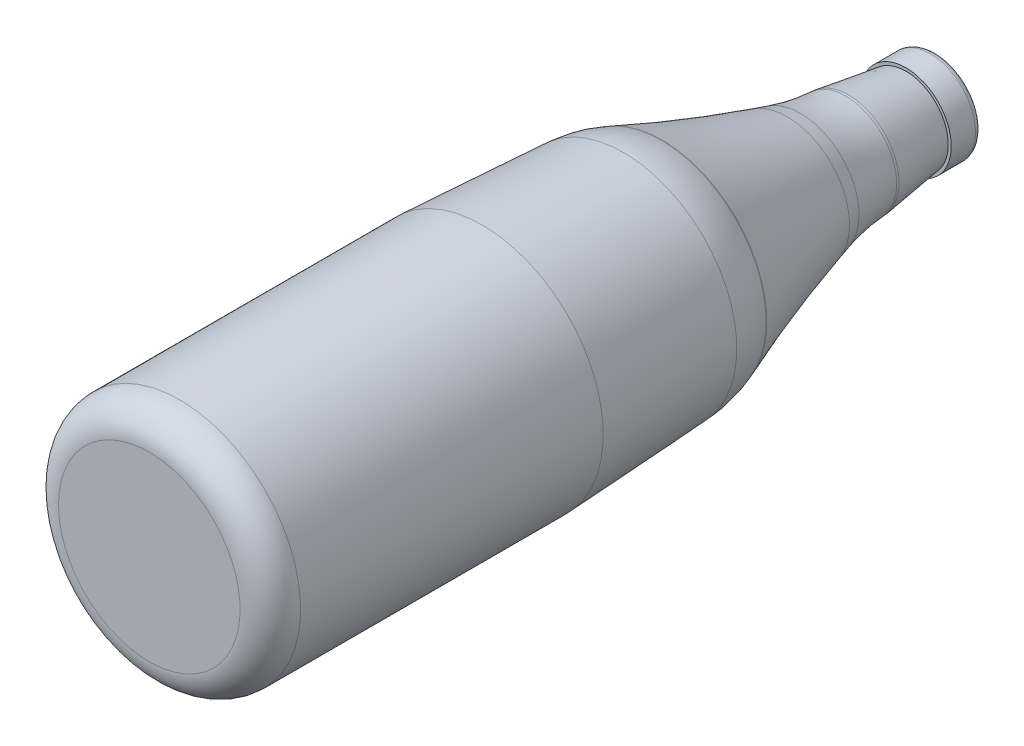
ISO-10303-21;
HEADER;
FILE_DESCRIPTION(('STEP AP214'),'2;1');
FILE_NAME('part.step','',(''),(''),'','','');
FILE_SCHEMA(('AUTOMOTIVE_DESIGN { 1 0 10303 214 1 1 1 1 }'));
ENDSEC;
DATA;
#1=APPLICATION_CONTEXT('core data for automotive mechanical design processes');
#2=APPLICATION_PROTOCOL_DEFINITION('international standard','automotive_design',2000,#1);
#3=PRODUCT_CONTEXT('',#1,'mechanical');
#4=PRODUCT('Part','Part','',(#3));
#5=PRODUCT_RELATED_PRODUCT_CATEGORY('part','',(#4));
#6=PRODUCT_DEFINITION_FORMATION('','',#4);
#7=PRODUCT_DEFINITION_CONTEXT('part definition',#1,'design');
#8=PRODUCT_DEFINITION('design','',#6,#7);
#9=PRODUCT_DEFINITION_SHAPE('','',#8);
#10=(LENGTH_UNIT() NAMED_UNIT(*) SI_UNIT(.MILLI.,.METRE.));
#11=(NAMED_UNIT(*) PLANE_ANGLE_UNIT() SI_UNIT($,.RADIAN.));
#12=(NAMED_UNIT(*) SI_UNIT($,.STERADIAN.) SOLID_ANGLE_UNIT());
#13=UNCERTAINTY_MEASURE_WITH_UNIT(LENGTH_MEASURE(1.E-05),#10,'distance_accuracy_value','');
#14=(GEOMETRIC_REPRESENTATION_CONTEXT(3) GLOBAL_UNCERTAINTY_ASSIGNED_CONTEXT((#13)) GLOBAL_UNIT_ASSIGNED_CONTEXT((#10,
#11,#12)) REPRESENTATION_CONTEXT('',''));
#15=CARTESIAN_POINT('',(0.,0.,0.));
#16=DIRECTION('',(0.,0.,1.));
#17=DIRECTION('',(1.,0.,0.));
#18=AXIS2_PLACEMENT_3D('',#15,#16,#17);
#19=CARTESIAN_POINT('',(0.,0.,-85.2037444977746));
#20=DIRECTION('',(0.,0.,1.));
#21=DIRECTION('',(1.,0.,0.));
#22=AXIS2_PLACEMENT_3D('',#19,#20,#21);
#23=PLANE('',#22);
#24=CARTESIAN_POINT('',(0.,0.,-85.2037444977746));
#25=DIRECTION('',(0.,0.,1.));
#26=DIRECTION('',(1.,0.,0.));
#27=AXIS2_PLACEMENT_3D('',#24,#25,#26);
#28=CIRCLE('',#27,13.);
#29=CARTESIAN_POINT('',(13.,0.,-85.2037444977746));
#30=VERTEX_POINT('',#29);
#31=EDGE_CURVE('E38',#30,#30,#28,.F.);
#32=ORIENTED_EDGE('',*,*,#31,.T.);
#33=EDGE_LOOP('',(#32));
#34=FACE_BOUND('',#33,.T.);
#35=ADVANCED_FACE('F31',(#34),#23,.F.);
#36=CARTESIAN_POINT('',(0.,0.,-47.7131293032761));
#37=DIRECTION('',(0.,0.,-1.));
#38=DIRECTION('',(-1.,0.,0.));
#39=AXIS2_PLACEMENT_3D('',#36,#37,#38);
#40=CYLINDRICAL_SURFACE('',#39,15.);
#41=CARTESIAN_POINT('',(0.,0.,-83.2037444977746));
#42=DIRECTION('',(0.,0.,1.));
#43=DIRECTION('',(1.,0.,0.));
#44=AXIS2_PLACEMENT_3D('',#41,#42,#43);
#45=CIRCLE('',#44,15.);
#46=CARTESIAN_POINT('',(15.,0.,-83.2037444977746));
#47=VERTEX_POINT('',#46);
#48=EDGE_CURVE('E10',#47,#47,#45,.T.);
#49=ORIENTED_EDGE('',*,*,#48,.T.);
#50=EDGE_LOOP('',(#49));
#51=FACE_BOUND('',#50,.T.);
#52=CARTESIAN_POINT('',(0.,0.,-75.2037444977746));
#53=DIRECTION('',(0.,0.,-1.));
#54=DIRECTION('',(-1.,0.,0.));
#55=AXIS2_PLACEMENT_3D('',#52,#53,#54);
#56=CIRCLE('',#55,15.);
#57=CARTESIAN_POINT('',(-15.,0.,-75.2037444977746));
#58=VERTEX_POINT('',#57);
#59=EDGE_CURVE('E42',#58,#58,#56,.T.);
#60=ORIENTED_EDGE('',*,*,#59,.T.);
#61=EDGE_LOOP('',(#60));
#62=FACE_BOUND('',#61,.T.);
#63=ADVANCED_FACE('F96',(#51,#62),#40,.T.);
#64=CARTESIAN_POINT('',(15.,0.,-75.2037444977746));
#65=DIRECTION('',(0.,0.,-1.));
#66=DIRECTION('',(-1.,0.,0.));
#67=AXIS2_PLACEMENT_3D('',#64,#65,#66);
#68=PLANE('',#67);
#69=ORIENTED_EDGE('',*,*,#59,.F.);
#70=EDGE_LOOP('',(#69));
#71=FACE_BOUND('',#70,.T.);
#72=CARTESIAN_POINT('',(0.,0.,-75.2037444977746));
#73=DIRECTION('',(0.,0.,-1.));
#74=DIRECTION('',(-1.,0.,0.));
#75=AXIS2_PLACEMENT_3D('',#72,#73,#74);
#76=CIRCLE('',#75,14.);
#77=CARTESIAN_POINT('',(-14.,0.,-75.2037444977746));
#78=VERTEX_POINT('',#77);
#79=EDGE_CURVE('E46',#78,#78,#76,.T.);
#80=ORIENTED_EDGE('',*,*,#79,.T.);
#81=EDGE_LOOP('',(#80));
#82=FACE_BOUND('',#81,.T.);
#83=ADVANCED_FACE('F100',(#71,#82),#68,.F.);
#84=CARTESIAN_POINT('',(0.,0.,-56.1872968553292));
#85=DIRECTION('',(0.,0.,1.));
#86=DIRECTION('',(1.,0.,0.));
#87=AXIS2_PLACEMENT_3D('',#84,#85,#86);
#88=CONICAL_SURFACE('',#87,16.7554308589901,0.143895780451387);
#89=ORIENTED_EDGE('',*,*,#79,.F.);
#90=EDGE_LOOP('',(#89));
#91=FACE_BOUND('',#90,.T.);
#92=CARTESIAN_POINT('',(0.,0.,-56.1872968553292));
#93=DIRECTION('',(0.,0.,-1.));
#94=DIRECTION('',(-1.,0.,0.));
#95=AXIS2_PLACEMENT_3D('',#92,#93,#94);
#96=CIRCLE('',#95,16.7554308589901);
#97=CARTESIAN_POINT('',(-16.7554308589901,0.,-56.1872968553292));
#98=VERTEX_POINT('',#97);
#99=EDGE_CURVE('E51',#98,#98,#96,.T.);
#100=ORIENTED_EDGE('',*,*,#99,.T.);
#101=EDGE_LOOP('',(#100));
#102=FACE_BOUND('',#101,.T.);
#103=ADVANCED_FACE('F105',(#91,#102),#88,.T.);
#104=CARTESIAN_POINT('',(0.,0.,-55.3556724236003));
#105=DIRECTION('',(0.,0.,1.));
#106=DIRECTION('',(1.,0.,0.));
#107=AXIS2_PLACEMENT_3D('',#104,#105,#106);
#108=CONICAL_SURFACE('',#107,16.8052739679812,0.0598630269945555);
#109=ORIENTED_EDGE('',*,*,#99,.F.);
#110=EDGE_LOOP('',(#109));
#111=FACE_BOUND('',#110,.T.);
#112=CARTESIAN_POINT('',(0.,0.,-55.3556724236003));
#113=DIRECTION('',(0.,0.,-1.));
#114=DIRECTION('',(-1.,0.,0.));
#115=AXIS2_PLACEMENT_3D('',#112,#113,#114);
#116=CIRCLE('',#115,16.8052739679812);
#117=CARTESIAN_POINT('',(-16.8052739679812,0.,-55.3556724236003));
#118=VERTEX_POINT('',#117);
#119=EDGE_CURVE('E54',#118,#118,#116,.T.);
#120=ORIENTED_EDGE('',*,*,#119,.T.);
#121=EDGE_LOOP('',(#120));
#122=FACE_BOUND('',#121,.T.);
#123=ADVANCED_FACE('F109',(#111,#122),#108,.T.);
#124=CARTESIAN_POINT('',(0.,0.,-59.5435819808559));
#125=DIRECTION('',(0.,0.,-1.));
#126=DIRECTION('',(-1.,0.,0.));
#127=AXIS2_PLACEMENT_3D('',#124,#125,#126);
#128=TOROIDAL_SURFACE('',#127,86.6798860494793,69.9999999999971);
#129=ORIENTED_EDGE('',*,*,#119,.F.);
#130=EDGE_LOOP('',(#129));
#131=FACE_BOUND('',#130,.T.);
#132=CARTESIAN_POINT('',(0.,0.,-40.3502934418562));
#133=DIRECTION('',(0.,0.,-1.));
#134=DIRECTION('',(-1.,0.,0.));
#135=AXIS2_PLACEMENT_3D('',#132,#133,#134);
#136=CIRCLE('',#135,19.3625949939244);
#137=CARTESIAN_POINT('',(-19.3625949939244,0.,-40.3502934418562));
#138=VERTEX_POINT('',#137);
#139=EDGE_CURVE('E57',#138,#138,#136,.T.);
#140=ORIENTED_EDGE('',*,*,#139,.T.);
#141=EDGE_LOOP('',(#140));
#142=FACE_BOUND('',#141,.T.);
#143=ADVANCED_FACE('F113',(#131,#142),#128,.F.);
#144=CARTESIAN_POINT('',(0.,0.,-35.9604434467862));
#145=DIRECTION('',(0.,0.,1.));
#146=DIRECTION('',(1.,0.,0.));
#147=AXIS2_PLACEMENT_3D('',#144,#145,#146);
#148=CONICAL_SURFACE('',#147,20.6142148419184,0.277747150954912);
#149=ORIENTED_EDGE('',*,*,#139,.F.);
#150=EDGE_LOOP('',(#149));
#151=FACE_BOUND('',#150,.T.);
#152=CARTESIAN_POINT('',(0.,0.,-35.9604434467862));
#153=DIRECTION('',(0.,0.,-1.));
#154=DIRECTION('',(-1.,0.,0.));
#155=AXIS2_PLACEMENT_3D('',#152,#153,#154);
#156=CIRCLE('',#155,20.6142148419184);
#157=CARTESIAN_POINT('',(-20.6142148419184,0.,-35.9604434467862));
#158=VERTEX_POINT('',#157);
#159=EDGE_CURVE('E60',#158,#158,#156,.T.);
#160=ORIENTED_EDGE('',*,*,#159,.T.);
#161=EDGE_LOOP('',(#160));
#162=FACE_BOUND('',#161,.T.);
#163=ADVANCED_FACE('F117',(#151,#162),#148,.T.);
#164=CARTESIAN_POINT('',(0.,0.,-159.345869768937));
#165=DIRECTION('',(0.,0.,-1.));
#166=DIRECTION('',(-1.,0.,0.));
#167=AXIS2_PLACEMENT_3D('',#164,#165,#166);
#168=TOROIDAL_SURFACE('',#167,453.368228770501,449.999999999998);
#169=ORIENTED_EDGE('',*,*,#159,.F.);
#170=EDGE_LOOP('',(#169));
#171=FACE_BOUND('',#170,.T.);
#172=CARTESIAN_POINT('',(0.,0.,5.3451176912668));
#173=DIRECTION('',(0.,0.,-1.));
#174=DIRECTION('',(-1.,0.,0.));
#175=AXIS2_PLACEMENT_3D('',#172,#173,#174);
#176=CIRCLE('',#175,34.5880016233948);
#177=CARTESIAN_POINT('',(-34.5880016233948,0.,5.3451176912668));
#178=VERTEX_POINT('',#177);
#179=EDGE_CURVE('E63',#178,#178,#176,.T.);
#180=ORIENTED_EDGE('',*,*,#179,.T.);
#181=EDGE_LOOP('',(#180));
#182=FACE_BOUND('',#181,.T.);
#183=ADVANCED_FACE('F121',(#171,#182),#168,.F.);
#184=CARTESIAN_POINT('',(0.,0.,5.65901866877483));
#185=DIRECTION('',(0.,0.,1.));
#186=DIRECTION('',(1.,0.,0.));
#187=AXIS2_PLACEMENT_3D('',#184,#185,#186);
#188=CONICAL_SURFACE('',#187,34.7114474276596,0.374685613690692);
#189=ORIENTED_EDGE('',*,*,#179,.F.);
#190=EDGE_LOOP('',(#189));
#191=FACE_BOUND('',#190,.T.);
#192=CARTESIAN_POINT('',(0.,0.,5.65901866877483));
#193=DIRECTION('',(0.,0.,-1.));
#194=DIRECTION('',(-1.,0.,0.));
#195=AXIS2_PLACEMENT_3D('',#192,#193,#194);
#196=CIRCLE('',#195,34.7114474276596);
#197=CARTESIAN_POINT('',(-34.7114474276596,0.,5.65901866877483));
#198=VERTEX_POINT('',#197);
#199=EDGE_CURVE('E66',#198,#198,#196,.T.);
#200=ORIENTED_EDGE('',*,*,#199,.T.);
#201=EDGE_LOOP('',(#200));
#202=FACE_BOUND('',#201,.T.);
#203=ADVANCED_FACE('F125',(#191,#202),#188,.T.);
#204=CARTESIAN_POINT('',(0.,0.,20.2982175541285));
#205=DIRECTION('',(0.,0.,-1.));
#206=DIRECTION('',(-1.,0.,0.));
#207=AXIS2_PLACEMENT_3D('',#204,#205,#206);
#208=DEGENERATE_TOROIDAL_SURFACE('',#207,2.51346165209086,40.000000000008,.F.);
#209=ORIENTED_EDGE('',*,*,#199,.F.);
#210=EDGE_LOOP('',(#209));
#211=FACE_BOUND('',#210,.T.);
#212=CARTESIAN_POINT('',(0.,0.,18.0967493815123));
#213=DIRECTION('',(0.,0.,-1.));
#214=DIRECTION('',(-1.,0.,0.));
#215=AXIS2_PLACEMENT_3D('',#212,#213,#214);
#216=CIRCLE('',#215,37.4259116264873);
#217=CARTESIAN_POINT('',(-37.4259116264873,0.,18.0967493815123));
#218=VERTEX_POINT('',#217);
#219=EDGE_CURVE('E69',#218,#218,#216,.T.);
#220=ORIENTED_EDGE('',*,*,#219,.T.);
#221=EDGE_LOOP('',(#220));
#222=FACE_BOUND('',#221,.T.);
#223=ADVANCED_FACE('F129',(#211,#222),#208,.F.);
#224=CARTESIAN_POINT('',(0.,0.,64.7962555022254));
#225=DIRECTION('',(0.,0.,1.));
#226=DIRECTION('',(1.,0.,0.));
#227=AXIS2_PLACEMENT_3D('',#224,#225,#226);
#228=CONICAL_SURFACE('',#227,40.,0.0550645269753344);
#229=ORIENTED_EDGE('',*,*,#219,.F.);
#230=EDGE_LOOP('',(#229));
#231=FACE_BOUND('',#230,.T.);
#232=CARTESIAN_POINT('',(0.,0.,64.7962555022254));
#233=DIRECTION('',(0.,0.,-1.));
#234=DIRECTION('',(-1.,0.,0.));
#235=AXIS2_PLACEMENT_3D('',#232,#233,#234);
#236=CIRCLE('',#235,40.);
#237=CARTESIAN_POINT('',(-40.,0.,64.7962555022254));
#238=VERTEX_POINT('',#237);
#239=EDGE_CURVE('E72',#238,#238,#236,.T.);
#240=ORIENTED_EDGE('',*,*,#239,.T.);
#241=EDGE_LOOP('',(#240));
#242=FACE_BOUND('',#241,.T.);
#243=ADVANCED_FACE('F133',(#231,#242),#228,.T.);
#244=CARTESIAN_POINT('',(0.,0.,-47.7131293032761));
#245=DIRECTION('',(0.,0.,-1.));
#246=DIRECTION('',(-1.,0.,0.));
#247=AXIS2_PLACEMENT_3D('',#244,#245,#246);
#248=CYLINDRICAL_SURFACE('',#247,40.);
#249=ORIENTED_EDGE('',*,*,#239,.F.);
#250=EDGE_LOOP('',(#249));
#251=FACE_BOUND('',#250,.T.);
#252=CARTESIAN_POINT('',(0.,0.,164.796255502225));
#253=DIRECTION('',(0.,0.,-1.));
#254=DIRECTION('',(-1.,0.,0.));
#255=AXIS2_PLACEMENT_3D('',#252,#253,#254);
#256=CIRCLE('',#255,40.);
#257=CARTESIAN_POINT('',(-40.,0.,164.796255502225));
#258=VERTEX_POINT('',#257);
#259=EDGE_CURVE('E75',#258,#258,#256,.T.);
#260=ORIENTED_EDGE('',*,*,#259,.T.);
#261=EDGE_LOOP('',(#260));
#262=FACE_BOUND('',#261,.T.);
#263=ADVANCED_FACE('F92',(#251,#262),#248,.T.);
#264=CARTESIAN_POINT('',(0.,0.,164.796255502225));
#265=DIRECTION('',(0.,0.,-1.));
#266=DIRECTION('',(-1.,0.,0.));
#267=AXIS2_PLACEMENT_3D('',#264,#265,#266);
#268=TOROIDAL_SURFACE('',#267,30.,10.);
#269=ORIENTED_EDGE('',*,*,#259,.F.);
#270=EDGE_LOOP('',(#269));
#271=FACE_BOUND('',#270,.T.);
#272=CARTESIAN_POINT('',(0.,0.,174.796255502226));
#273=DIRECTION('',(0.,0.,-1.));
#274=DIRECTION('',(-1.,0.,0.));
#275=AXIS2_PLACEMENT_3D('',#272,#273,#274);
#276=CIRCLE('',#275,30.);
#277=CARTESIAN_POINT('',(-30.,0.,174.796255502226));
#278=VERTEX_POINT('',#277);
#279=EDGE_CURVE('E78',#278,#278,#276,.T.);
#280=ORIENTED_EDGE('',*,*,#279,.T.);
#281=EDGE_LOOP('',(#280));
#282=FACE_BOUND('',#281,.T.);
#283=ADVANCED_FACE('F82',(#271,#282),#268,.T.);
#284=CARTESIAN_POINT('',(0.,0.,174.796255502226));
#285=DIRECTION('',(0.,0.,-1.));
#286=DIRECTION('',(-1.,0.,0.));
#287=AXIS2_PLACEMENT_3D('',#284,#285,#286);
#288=PLANE('',#287);
#289=ORIENTED_EDGE('',*,*,#279,.F.);
#290=EDGE_LOOP('',(#289));
#291=FACE_BOUND('',#290,.T.);
#292=ADVANCED_FACE('F84',(#291),#288,.F.);
#293=CARTESIAN_POINT('',(0.,0.,-83.2037444977746));
#294=DIRECTION('',(0.,0.,1.));
#295=DIRECTION('',(1.,0.,0.));
#296=AXIS2_PLACEMENT_3D('',#293,#294,#295);
#297=TOROIDAL_SURFACE('',#296,13.,2.);
#298=ORIENTED_EDGE('',*,*,#48,.F.);
#299=EDGE_LOOP('',(#298));
#300=FACE_BOUND('',#299,.T.);
#301=ORIENTED_EDGE('',*,*,#31,.F.);
#302=EDGE_LOOP('',(#301));
#303=FACE_BOUND('',#302,.T.);
#304=ADVANCED_FACE('F33',(#300,#303),#297,.T.);
#305=CLOSED_SHELL('',(#35,#63,#83,#103,#123,#143,#163,#183,#203,#223,#243,#263,#283,#292,#304));
#306=MANIFOLD_SOLID_BREP('B2',#305);
#307=ADVANCED_BREP_SHAPE_REPRESENTATION('',(#18,#306),#14);
#308=SHAPE_DEFINITION_REPRESENTATION(#9,#307);
ENDSEC;
END-ISO-10303-21;
